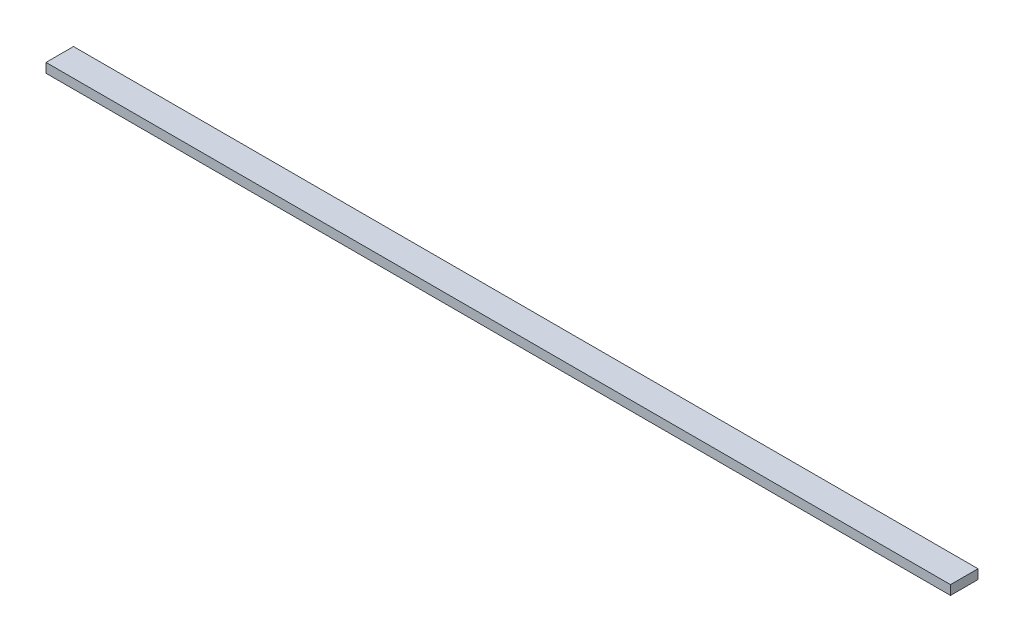
ISO-10303-21;
HEADER;
FILE_DESCRIPTION(('STEP AP214'),'2;1');
FILE_NAME('part.step','',(''),(''),'','','');
FILE_SCHEMA(('AUTOMOTIVE_DESIGN { 1 0 10303 214 1 1 1 1 }'));
ENDSEC;
DATA;
#1=APPLICATION_CONTEXT('core data for automotive mechanical design processes');
#2=APPLICATION_PROTOCOL_DEFINITION('international standard','automotive_design',2000,#1);
#3=PRODUCT_CONTEXT('',#1,'mechanical');
#4=PRODUCT('Part','Part','',(#3));
#5=PRODUCT_RELATED_PRODUCT_CATEGORY('part','',(#4));
#6=PRODUCT_DEFINITION_FORMATION('','',#4);
#7=PRODUCT_DEFINITION_CONTEXT('part definition',#1,'design');
#8=PRODUCT_DEFINITION('design','',#6,#7);
#9=PRODUCT_DEFINITION_SHAPE('','',#8);
#10=(LENGTH_UNIT() NAMED_UNIT(*) SI_UNIT(.MILLI.,.METRE.));
#11=(NAMED_UNIT(*) PLANE_ANGLE_UNIT() SI_UNIT($,.RADIAN.));
#12=(NAMED_UNIT(*) SI_UNIT($,.STERADIAN.) SOLID_ANGLE_UNIT());
#13=UNCERTAINTY_MEASURE_WITH_UNIT(LENGTH_MEASURE(1.E-05),#10,'distance_accuracy_value','');
#14=(GEOMETRIC_REPRESENTATION_CONTEXT(3) GLOBAL_UNCERTAINTY_ASSIGNED_CONTEXT((#13)) GLOBAL_UNIT_ASSIGNED_CONTEXT((#10,
#11,#12)) REPRESENTATION_CONTEXT('',''));
#15=CARTESIAN_POINT('',(0.,0.,0.));
#16=DIRECTION('',(0.,0.,1.));
#17=DIRECTION('',(1.,0.,0.));
#18=AXIS2_PLACEMENT_3D('',#15,#16,#17);
#19=CARTESIAN_POINT('',(304.8,6.35,9.271));
#20=DIRECTION('',(-1.,0.,0.));
#21=DIRECTION('',(0.,0.,1.));
#22=AXIS2_PLACEMENT_3D('',#19,#20,#21);
#23=PLANE('',#22);
#24=DIRECTION('',(0.,0.,-1.));
#25=VECTOR('',#24,1.);
#26=CARTESIAN_POINT('',(304.8,0.,9.271));
#27=LINE('',#26,#25);
#28=CARTESIAN_POINT('',(304.8,0.,9.271));
#29=VERTEX_POINT('',#28);
#30=CARTESIAN_POINT('',(304.8,0.,-9.271));
#31=VERTEX_POINT('',#30);
#32=EDGE_CURVE('E107',#29,#31,#27,.T.);
#33=ORIENTED_EDGE('',*,*,#32,.T.);
#34=DIRECTION('',(0.,-1.,0.));
#35=VECTOR('',#34,1.);
#36=CARTESIAN_POINT('',(304.8,6.35,-9.271));
#37=LINE('',#36,#35);
#38=CARTESIAN_POINT('',(304.8,6.35,-9.271));
#39=VERTEX_POINT('',#38);
#40=EDGE_CURVE('E11',#39,#31,#37,.T.);
#41=ORIENTED_EDGE('',*,*,#40,.F.);
#42=DIRECTION('',(0.,0.,-1.));
#43=VECTOR('',#42,1.);
#44=CARTESIAN_POINT('',(304.8,6.35,9.271));
#45=LINE('',#44,#43);
#46=CARTESIAN_POINT('',(304.8,6.35,9.271));
#47=VERTEX_POINT('',#46);
#48=EDGE_CURVE('E91',#47,#39,#45,.T.);
#49=ORIENTED_EDGE('',*,*,#48,.F.);
#50=DIRECTION('',(0.,-1.,0.));
#51=VECTOR('',#50,1.);
#52=CARTESIAN_POINT('',(304.8,6.35,9.271));
#53=LINE('',#52,#51);
#54=EDGE_CURVE('E103',#47,#29,#53,.T.);
#55=ORIENTED_EDGE('',*,*,#54,.T.);
#56=EDGE_LOOP('',(#33,#41,#49,#55));
#57=FACE_BOUND('',#56,.T.);
#58=ADVANCED_FACE('F39',(#57),#23,.F.);
#59=CARTESIAN_POINT('',(-304.8,6.35,-9.271));
#60=DIRECTION('',(0.,0.,1.));
#61=DIRECTION('',(1.,0.,0.));
#62=AXIS2_PLACEMENT_3D('',#59,#60,#61);
#63=PLANE('',#62);
#64=DIRECTION('',(-1.,0.,0.));
#65=VECTOR('',#64,1.);
#66=CARTESIAN_POINT('',(-304.8,0.,-9.271));
#67=LINE('',#66,#65);
#68=CARTESIAN_POINT('',(-304.8,0.,-9.271));
#69=VERTEX_POINT('',#68);
#70=EDGE_CURVE('E96',#31,#69,#67,.T.);
#71=ORIENTED_EDGE('',*,*,#70,.T.);
#72=DIRECTION('',(0.,-1.,0.));
#73=VECTOR('',#72,1.);
#74=CARTESIAN_POINT('',(-304.8,6.35,-9.271));
#75=LINE('',#74,#73);
#76=CARTESIAN_POINT('',(-304.8,6.35,-9.271));
#77=VERTEX_POINT('',#76);
#78=EDGE_CURVE('E48',#77,#69,#75,.T.);
#79=ORIENTED_EDGE('',*,*,#78,.F.);
#80=DIRECTION('',(-1.,0.,0.));
#81=VECTOR('',#80,1.);
#82=CARTESIAN_POINT('',(-304.8,6.35,-9.271));
#83=LINE('',#82,#81);
#84=EDGE_CURVE('E86',#39,#77,#83,.T.);
#85=ORIENTED_EDGE('',*,*,#84,.F.);
#86=ORIENTED_EDGE('',*,*,#40,.T.);
#87=EDGE_LOOP('',(#71,#79,#85,#86));
#88=FACE_BOUND('',#87,.T.);
#89=ADVANCED_FACE('F95',(#88),#63,.F.);
#90=CARTESIAN_POINT('',(-304.8,6.35,9.271));
#91=DIRECTION('',(1.,0.,0.));
#92=DIRECTION('',(0.,0.,-1.));
#93=AXIS2_PLACEMENT_3D('',#90,#91,#92);
#94=PLANE('',#93);
#95=DIRECTION('',(0.,0.,1.));
#96=VECTOR('',#95,1.);
#97=CARTESIAN_POINT('',(-304.8,0.,9.271));
#98=LINE('',#97,#96);
#99=CARTESIAN_POINT('',(-304.8,0.,9.271));
#100=VERTEX_POINT('',#99);
#101=EDGE_CURVE('E73',#69,#100,#98,.T.);
#102=ORIENTED_EDGE('',*,*,#101,.T.);
#103=DIRECTION('',(0.,-1.,0.));
#104=VECTOR('',#103,1.);
#105=CARTESIAN_POINT('',(-304.8,6.35,9.271));
#106=LINE('',#105,#104);
#107=CARTESIAN_POINT('',(-304.8,6.35,9.271));
#108=VERTEX_POINT('',#107);
#109=EDGE_CURVE('E98',#108,#100,#106,.T.);
#110=ORIENTED_EDGE('',*,*,#109,.F.);
#111=DIRECTION('',(0.,0.,1.));
#112=VECTOR('',#111,1.);
#113=CARTESIAN_POINT('',(-304.8,6.35,9.271));
#114=LINE('',#113,#112);
#115=EDGE_CURVE('E89',#77,#108,#114,.T.);
#116=ORIENTED_EDGE('',*,*,#115,.F.);
#117=ORIENTED_EDGE('',*,*,#78,.T.);
#118=EDGE_LOOP('',(#102,#110,#116,#117));
#119=FACE_BOUND('',#118,.T.);
#120=ADVANCED_FACE('F99',(#119),#94,.F.);
#121=CARTESIAN_POINT('',(-304.8,6.35,9.271));
#122=DIRECTION('',(0.,0.,-1.));
#123=DIRECTION('',(-1.,0.,0.));
#124=AXIS2_PLACEMENT_3D('',#121,#122,#123);
#125=PLANE('',#124);
#126=DIRECTION('',(1.,0.,0.));
#127=VECTOR('',#126,1.);
#128=CARTESIAN_POINT('',(-304.8,0.,9.271));
#129=LINE('',#128,#127);
#130=EDGE_CURVE('E79',#100,#29,#129,.T.);
#131=ORIENTED_EDGE('',*,*,#130,.T.);
#132=ORIENTED_EDGE('',*,*,#54,.F.);
#133=DIRECTION('',(1.,0.,0.));
#134=VECTOR('',#133,1.);
#135=CARTESIAN_POINT('',(-304.8,6.35,9.271));
#136=LINE('',#135,#134);
#137=EDGE_CURVE('E56',#108,#47,#136,.T.);
#138=ORIENTED_EDGE('',*,*,#137,.F.);
#139=ORIENTED_EDGE('',*,*,#109,.T.);
#140=EDGE_LOOP('',(#131,#132,#138,#139));
#141=FACE_BOUND('',#140,.T.);
#142=ADVANCED_FACE('F120',(#141),#125,.F.);
#143=CARTESIAN_POINT('',(0.,6.35,0.));
#144=DIRECTION('',(0.,-1.,0.));
#145=DIRECTION('',(0.,0.,-1.));
#146=AXIS2_PLACEMENT_3D('',#143,#144,#145);
#147=PLANE('',#146);
#148=ORIENTED_EDGE('',*,*,#48,.T.);
#149=ORIENTED_EDGE('',*,*,#84,.T.);
#150=ORIENTED_EDGE('',*,*,#115,.T.);
#151=ORIENTED_EDGE('',*,*,#137,.T.);
#152=EDGE_LOOP('',(#148,#149,#150,#151));
#153=FACE_BOUND('',#152,.T.);
#154=ADVANCED_FACE('F87',(#153),#147,.F.);
#155=CARTESIAN_POINT('',(0.,0.,0.));
#156=DIRECTION('',(0.,-1.,0.));
#157=DIRECTION('',(0.,0.,-1.));
#158=AXIS2_PLACEMENT_3D('',#155,#156,#157);
#159=PLANE('',#158);
#160=ORIENTED_EDGE('',*,*,#32,.F.);
#161=ORIENTED_EDGE('',*,*,#130,.F.);
#162=ORIENTED_EDGE('',*,*,#101,.F.);
#163=ORIENTED_EDGE('',*,*,#70,.F.);
#164=EDGE_LOOP('',(#160,#161,#162,#163));
#165=FACE_BOUND('',#164,.T.);
#166=ADVANCED_FACE('F123',(#165),#159,.T.);
#167=CLOSED_SHELL('',(#58,#89,#120,#142,#154,#166));
#168=MANIFOLD_SOLID_BREP('B2',#167);
#169=ADVANCED_BREP_SHAPE_REPRESENTATION('',(#18,#168),#14);
#170=SHAPE_DEFINITION_REPRESENTATION(#9,#169);
ENDSEC;
END-ISO-10303-21;
